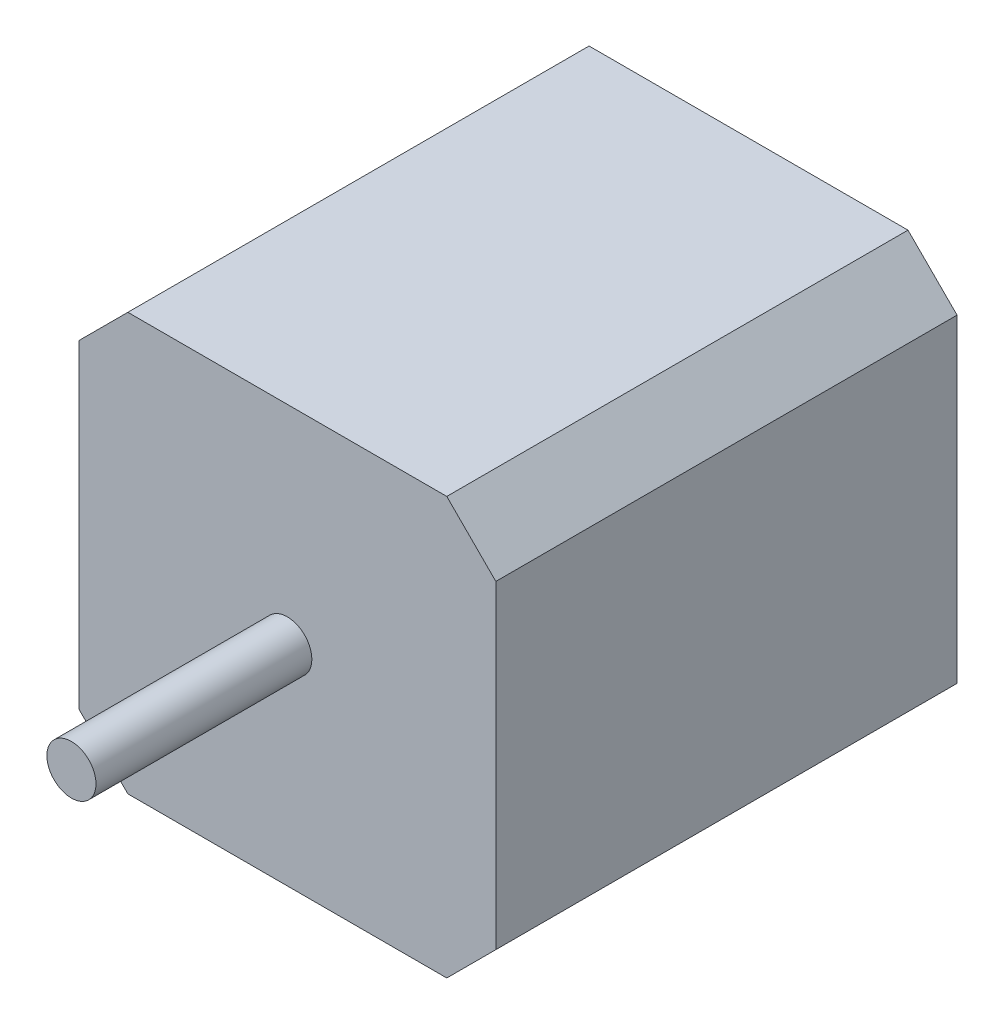
ISO-10303-21;
HEADER;
FILE_DESCRIPTION(('STEP AP214'),'2;1');
FILE_NAME('part.step','',(''),(''),'','','');
FILE_SCHEMA(('AUTOMOTIVE_DESIGN { 1 0 10303 214 1 1 1 1 }'));
ENDSEC;
DATA;
#1=APPLICATION_CONTEXT('core data for automotive mechanical design processes');
#2=APPLICATION_PROTOCOL_DEFINITION('international standard','automotive_design',2000,#1);
#3=PRODUCT_CONTEXT('',#1,'mechanical');
#4=PRODUCT('Part','Part','',(#3));
#5=PRODUCT_RELATED_PRODUCT_CATEGORY('part','',(#4));
#6=PRODUCT_DEFINITION_FORMATION('','',#4);
#7=PRODUCT_DEFINITION_CONTEXT('part definition',#1,'design');
#8=PRODUCT_DEFINITION('design','',#6,#7);
#9=PRODUCT_DEFINITION_SHAPE('','',#8);
#10=(LENGTH_UNIT() NAMED_UNIT(*) SI_UNIT(.MILLI.,.METRE.));
#11=(NAMED_UNIT(*) PLANE_ANGLE_UNIT() SI_UNIT($,.RADIAN.));
#12=(NAMED_UNIT(*) SI_UNIT($,.STERADIAN.) SOLID_ANGLE_UNIT());
#13=UNCERTAINTY_MEASURE_WITH_UNIT(LENGTH_MEASURE(1.E-05),#10,'distance_accuracy_value','');
#14=(GEOMETRIC_REPRESENTATION_CONTEXT(3) GLOBAL_UNCERTAINTY_ASSIGNED_CONTEXT((#13)) GLOBAL_UNIT_ASSIGNED_CONTEXT((#10,
#11,#12)) REPRESENTATION_CONTEXT('',''));
#15=CARTESIAN_POINT('',(0.,0.,0.));
#16=DIRECTION('',(0.,0.,1.));
#17=DIRECTION('',(1.,0.,0.));
#18=AXIS2_PLACEMENT_3D('',#15,#16,#17);
#19=CARTESIAN_POINT('',(0.,0.,47.));
#20=DIRECTION('',(0.,0.,1.));
#21=DIRECTION('',(1.,0.,0.));
#22=AXIS2_PLACEMENT_3D('',#19,#20,#21);
#23=PLANE('',#22);
#24=DIRECTION('',(1.,0.,0.));
#25=VECTOR('',#24,1.);
#26=CARTESIAN_POINT('',(-41.6448477794809,-14.902025479471,47.));
#27=LINE('',#26,#25);
#28=CARTESIAN_POINT('',(-36.6448477794809,-14.902025479471,47.));
#29=VERTEX_POINT('',#28);
#30=CARTESIAN_POINT('',(-4.14484777948092,-14.902025479471,47.));
#31=VERTEX_POINT('',#30);
#32=EDGE_CURVE('E169',#29,#31,#27,.T.);
#33=ORIENTED_EDGE('',*,*,#32,.T.);
#34=DIRECTION('',(-0.707106781186548,-0.707106781186547,0.));
#35=VECTOR('',#34,1.);
#36=CARTESIAN_POINT('',(5.37858884999505,-5.37858884999506,47.));
#37=LINE('',#36,#35);
#38=CARTESIAN_POINT('',(0.855152220519106,-9.90202547947099,47.));
#39=VERTEX_POINT('',#38);
#40=EDGE_CURVE('E147',#31,#39,#37,.F.);
#41=ORIENTED_EDGE('',*,*,#40,.T.);
#42=DIRECTION('',(0.,1.,0.));
#43=VECTOR('',#42,1.);
#44=CARTESIAN_POINT('',(0.855152220519101,27.597974520529,47.));
#45=LINE('',#44,#43);
#46=CARTESIAN_POINT('',(0.855152220519099,22.597974520529,47.));
#47=VERTEX_POINT('',#46);
#48=EDGE_CURVE('E118',#39,#47,#45,.T.);
#49=ORIENTED_EDGE('',*,*,#48,.T.);
#50=DIRECTION('',(0.707106781186547,-0.707106781186548,0.));
#51=VECTOR('',#50,1.);
#52=CARTESIAN_POINT('',(11.7265633705241,11.726563370524,47.));
#53=LINE('',#52,#51);
#54=CARTESIAN_POINT('',(-4.14484777948089,27.597974520529,47.));
#55=VERTEX_POINT('',#54);
#56=EDGE_CURVE('E54',#47,#55,#53,.F.);
#57=ORIENTED_EDGE('',*,*,#56,.T.);
#58=DIRECTION('',(-1.,0.,0.));
#59=VECTOR('',#58,1.);
#60=CARTESIAN_POINT('',(-41.6448477794809,27.597974520529,47.));
#61=LINE('',#60,#59);
#62=CARTESIAN_POINT('',(-36.6448477794809,27.597974520529,47.));
#63=VERTEX_POINT('',#62);
#64=EDGE_CURVE('E133',#55,#63,#61,.T.);
#65=ORIENTED_EDGE('',*,*,#64,.T.);
#66=DIRECTION('',(0.707106781186549,0.707106781186547,0.));
#67=VECTOR('',#66,1.);
#68=CARTESIAN_POINT('',(-32.1214111500049,32.121411150005,47.));
#69=LINE('',#68,#67);
#70=CARTESIAN_POINT('',(-41.6448477794809,22.597974520529,47.));
#71=VERTEX_POINT('',#70);
#72=EDGE_CURVE('E143',#63,#71,#69,.F.);
#73=ORIENTED_EDGE('',*,*,#72,.T.);
#74=DIRECTION('',(0.,-1.,0.));
#75=VECTOR('',#74,1.);
#76=CARTESIAN_POINT('',(-41.6448477794809,27.597974520529,47.));
#77=LINE('',#76,#75);
#78=CARTESIAN_POINT('',(-41.6448477794809,-9.90202547947095,47.));
#79=VERTEX_POINT('',#78);
#80=EDGE_CURVE('E127',#71,#79,#77,.T.);
#81=ORIENTED_EDGE('',*,*,#80,.T.);
#82=DIRECTION('',(-0.707106781186546,0.70710678118655,0.));
#83=VECTOR('',#82,1.);
#84=CARTESIAN_POINT('',(-25.773436629476,-25.7734366294759,47.));
#85=LINE('',#84,#83);
#86=EDGE_CURVE('E145',#79,#29,#85,.F.);
#87=ORIENTED_EDGE('',*,*,#86,.T.);
#88=EDGE_LOOP('',(#33,#41,#49,#57,#65,#73,#81,#87));
#89=FACE_BOUND('',#88,.T.);
#90=CARTESIAN_POINT('',(-20.3948477794809,6.347974520529,47.));
#91=DIRECTION('',(0.,0.,1.));
#92=DIRECTION('',(1.,0.,0.));
#93=AXIS2_PLACEMENT_3D('',#90,#91,#92);
#94=CIRCLE('',#93,2.5);
#95=CARTESIAN_POINT('',(-17.8948477794809,6.347974520529,47.));
#96=VERTEX_POINT('',#95);
#97=EDGE_CURVE('E174',#96,#96,#94,.T.);
#98=ORIENTED_EDGE('',*,*,#97,.F.);
#99=EDGE_LOOP('',(#98));
#100=FACE_BOUND('',#99,.T.);
#101=ADVANCED_FACE('F34',(#89,#100),#23,.T.);
#102=CARTESIAN_POINT('',(-41.6448477794809,27.597974520529,47.));
#103=DIRECTION('',(1.,0.,0.));
#104=DIRECTION('',(0.,0.,-1.));
#105=AXIS2_PLACEMENT_3D('',#102,#103,#104);
#106=PLANE('',#105);
#107=DIRECTION('',(0.,-1.,0.));
#108=VECTOR('',#107,1.);
#109=CARTESIAN_POINT('',(-41.6448477794809,27.597974520529,0.));
#110=LINE('',#109,#108);
#111=CARTESIAN_POINT('',(-41.6448477794809,22.597974520529,0.));
#112=VERTEX_POINT('',#111);
#113=CARTESIAN_POINT('',(-41.6448477794809,-9.90202547947096,0.));
#114=VERTEX_POINT('',#113);
#115=EDGE_CURVE('E129',#112,#114,#110,.T.);
#116=ORIENTED_EDGE('',*,*,#115,.T.);
#117=DIRECTION('',(0.,0.,1.));
#118=VECTOR('',#117,1.);
#119=CARTESIAN_POINT('',(-41.6448477794809,-9.90202547947096,47.));
#120=LINE('',#119,#118);
#121=EDGE_CURVE('E152',#114,#79,#120,.T.);
#122=ORIENTED_EDGE('',*,*,#121,.T.);
#123=ORIENTED_EDGE('',*,*,#80,.F.);
#124=DIRECTION('',(0.,0.,-1.));
#125=VECTOR('',#124,1.);
#126=CARTESIAN_POINT('',(-41.6448477794809,22.597974520529,47.));
#127=LINE('',#126,#125);
#128=EDGE_CURVE('E149',#71,#112,#127,.T.);
#129=ORIENTED_EDGE('',*,*,#128,.T.);
#130=EDGE_LOOP('',(#116,#122,#123,#129));
#131=FACE_BOUND('',#130,.T.);
#132=ADVANCED_FACE('F165',(#131),#106,.F.);
#133=CARTESIAN_POINT('',(-41.6448477794809,-14.902025479471,47.));
#134=DIRECTION('',(0.,1.,0.));
#135=DIRECTION('',(0.,0.,1.));
#136=AXIS2_PLACEMENT_3D('',#133,#134,#135);
#137=PLANE('',#136);
#138=DIRECTION('',(1.,0.,0.));
#139=VECTOR('',#138,1.);
#140=CARTESIAN_POINT('',(-41.6448477794809,-14.902025479471,0.));
#141=LINE('',#140,#139);
#142=CARTESIAN_POINT('',(-36.6448477794809,-14.902025479471,0.));
#143=VERTEX_POINT('',#142);
#144=CARTESIAN_POINT('',(-4.14484777948091,-14.902025479471,0.));
#145=VERTEX_POINT('',#144);
#146=EDGE_CURVE('E125',#143,#145,#141,.T.);
#147=ORIENTED_EDGE('',*,*,#146,.T.);
#148=DIRECTION('',(0.,0.,1.));
#149=VECTOR('',#148,1.);
#150=CARTESIAN_POINT('',(-4.14484777948091,-14.902025479471,47.));
#151=LINE('',#150,#149);
#152=EDGE_CURVE('E104',#145,#31,#151,.T.);
#153=ORIENTED_EDGE('',*,*,#152,.T.);
#154=ORIENTED_EDGE('',*,*,#32,.F.);
#155=DIRECTION('',(0.,0.,-1.));
#156=VECTOR('',#155,1.);
#157=CARTESIAN_POINT('',(-36.6448477794809,-14.902025479471,47.));
#158=LINE('',#157,#156);
#159=EDGE_CURVE('E109',#29,#143,#158,.T.);
#160=ORIENTED_EDGE('',*,*,#159,.T.);
#161=EDGE_LOOP('',(#147,#153,#154,#160));
#162=FACE_BOUND('',#161,.T.);
#163=ADVANCED_FACE('F192',(#162),#137,.F.);
#164=CARTESIAN_POINT('',(0.855152220519101,27.597974520529,47.));
#165=DIRECTION('',(-1.,0.,0.));
#166=DIRECTION('',(0.,-1.,0.));
#167=AXIS2_PLACEMENT_3D('',#164,#165,#166);
#168=PLANE('',#167);
#169=ORIENTED_EDGE('',*,*,#48,.F.);
#170=DIRECTION('',(0.,0.,-1.));
#171=VECTOR('',#170,1.);
#172=CARTESIAN_POINT('',(0.855152220519105,-9.90202547947099,47.));
#173=LINE('',#172,#171);
#174=CARTESIAN_POINT('',(0.855152220519107,-9.90202547947099,0.));
#175=VERTEX_POINT('',#174);
#176=EDGE_CURVE('E103',#39,#175,#173,.T.);
#177=ORIENTED_EDGE('',*,*,#176,.T.);
#178=DIRECTION('',(0.,1.,0.));
#179=VECTOR('',#178,1.);
#180=CARTESIAN_POINT('',(0.855152220519101,27.597974520529,0.));
#181=LINE('',#180,#179);
#182=CARTESIAN_POINT('',(0.855152220519102,22.597974520529,0.));
#183=VERTEX_POINT('',#182);
#184=EDGE_CURVE('E116',#175,#183,#181,.T.);
#185=ORIENTED_EDGE('',*,*,#184,.T.);
#186=DIRECTION('',(0.,0.,1.));
#187=VECTOR('',#186,1.);
#188=CARTESIAN_POINT('',(0.855152220519102,22.597974520529,47.));
#189=LINE('',#188,#187);
#190=EDGE_CURVE('E120',#183,#47,#189,.T.);
#191=ORIENTED_EDGE('',*,*,#190,.T.);
#192=EDGE_LOOP('',(#169,#177,#185,#191));
#193=FACE_BOUND('',#192,.T.);
#194=ADVANCED_FACE('F115',(#193),#168,.F.);
#195=CARTESIAN_POINT('',(-41.6448477794809,27.597974520529,47.));
#196=DIRECTION('',(0.,-1.,0.));
#197=DIRECTION('',(0.,0.,-1.));
#198=AXIS2_PLACEMENT_3D('',#195,#196,#197);
#199=PLANE('',#198);
#200=DIRECTION('',(-1.,0.,0.));
#201=VECTOR('',#200,1.);
#202=CARTESIAN_POINT('',(-41.6448477794809,27.597974520529,0.));
#203=LINE('',#202,#201);
#204=CARTESIAN_POINT('',(-4.14484777948089,27.597974520529,0.));
#205=VERTEX_POINT('',#204);
#206=CARTESIAN_POINT('',(-36.6448477794809,27.597974520529,0.));
#207=VERTEX_POINT('',#206);
#208=EDGE_CURVE('E124',#205,#207,#203,.T.);
#209=ORIENTED_EDGE('',*,*,#208,.T.);
#210=DIRECTION('',(0.,0.,1.));
#211=VECTOR('',#210,1.);
#212=CARTESIAN_POINT('',(-36.6448477794809,27.597974520529,47.));
#213=LINE('',#212,#211);
#214=EDGE_CURVE('E11',#207,#63,#213,.T.);
#215=ORIENTED_EDGE('',*,*,#214,.T.);
#216=ORIENTED_EDGE('',*,*,#64,.F.);
#217=DIRECTION('',(0.,0.,-1.));
#218=VECTOR('',#217,1.);
#219=CARTESIAN_POINT('',(-4.14484777948088,27.597974520529,47.));
#220=LINE('',#219,#218);
#221=EDGE_CURVE('E42',#55,#205,#220,.T.);
#222=ORIENTED_EDGE('',*,*,#221,.T.);
#223=EDGE_LOOP('',(#209,#215,#216,#222));
#224=FACE_BOUND('',#223,.T.);
#225=ADVANCED_FACE('F155',(#224),#199,.F.);
#226=CARTESIAN_POINT('',(0.,0.,0.));
#227=DIRECTION('',(0.,0.,1.));
#228=DIRECTION('',(1.,0.,0.));
#229=AXIS2_PLACEMENT_3D('',#226,#227,#228);
#230=PLANE('',#229);
#231=ORIENTED_EDGE('',*,*,#184,.F.);
#232=DIRECTION('',(0.707106781186548,0.707106781186547,0.));
#233=VECTOR('',#232,1.);
#234=CARTESIAN_POINT('',(0.855152220519105,-9.90202547947099,0.));
#235=LINE('',#234,#233);
#236=EDGE_CURVE('E99',#175,#145,#235,.F.);
#237=ORIENTED_EDGE('',*,*,#236,.T.);
#238=ORIENTED_EDGE('',*,*,#146,.F.);
#239=DIRECTION('',(0.707106781186546,-0.70710678118655,0.));
#240=VECTOR('',#239,1.);
#241=CARTESIAN_POINT('',(-36.6448477794809,-14.902025479471,0.));
#242=LINE('',#241,#240);
#243=EDGE_CURVE('E110',#143,#114,#242,.F.);
#244=ORIENTED_EDGE('',*,*,#243,.T.);
#245=ORIENTED_EDGE('',*,*,#115,.F.);
#246=DIRECTION('',(-0.707106781186549,-0.707106781186547,0.));
#247=VECTOR('',#246,1.);
#248=CARTESIAN_POINT('',(-41.6448477794809,22.597974520529,0.));
#249=LINE('',#248,#247);
#250=EDGE_CURVE('E136',#112,#207,#249,.F.);
#251=ORIENTED_EDGE('',*,*,#250,.T.);
#252=ORIENTED_EDGE('',*,*,#208,.F.);
#253=DIRECTION('',(-0.707106781186547,0.707106781186548,0.));
#254=VECTOR('',#253,1.);
#255=CARTESIAN_POINT('',(-4.14484777948088,27.597974520529,0.));
#256=LINE('',#255,#254);
#257=EDGE_CURVE('E119',#205,#183,#256,.F.);
#258=ORIENTED_EDGE('',*,*,#257,.T.);
#259=EDGE_LOOP('',(#231,#237,#238,#244,#245,#251,#252,#258));
#260=FACE_BOUND('',#259,.T.);
#261=ADVANCED_FACE('F122',(#260),#230,.F.);
#262=CARTESIAN_POINT('',(0.855152220519105,-9.90202547947099,47.));
#263=DIRECTION('',(-0.707106781186547,0.707106781186548,0.));
#264=DIRECTION('',(0.,0.,-1.));
#265=AXIS2_PLACEMENT_3D('',#262,#263,#264);
#266=PLANE('',#265);
#267=ORIENTED_EDGE('',*,*,#40,.F.);
#268=ORIENTED_EDGE('',*,*,#152,.F.);
#269=ORIENTED_EDGE('',*,*,#236,.F.);
#270=ORIENTED_EDGE('',*,*,#176,.F.);
#271=EDGE_LOOP('',(#267,#268,#269,#270));
#272=FACE_BOUND('',#271,.T.);
#273=ADVANCED_FACE('F102',(#272),#266,.F.);
#274=CARTESIAN_POINT('',(-36.6448477794809,-14.902025479471,47.));
#275=DIRECTION('',(0.70710678118655,0.707106781186546,0.));
#276=DIRECTION('',(0.,0.,-1.));
#277=AXIS2_PLACEMENT_3D('',#274,#275,#276);
#278=PLANE('',#277);
#279=ORIENTED_EDGE('',*,*,#86,.F.);
#280=ORIENTED_EDGE('',*,*,#121,.F.);
#281=ORIENTED_EDGE('',*,*,#243,.F.);
#282=ORIENTED_EDGE('',*,*,#159,.F.);
#283=EDGE_LOOP('',(#279,#280,#281,#282));
#284=FACE_BOUND('',#283,.T.);
#285=ADVANCED_FACE('F208',(#284),#278,.F.);
#286=CARTESIAN_POINT('',(-41.6448477794809,22.597974520529,47.));
#287=DIRECTION('',(0.707106781186546,-0.707106781186548,0.));
#288=DIRECTION('',(0.,0.,-1.));
#289=AXIS2_PLACEMENT_3D('',#286,#287,#288);
#290=PLANE('',#289);
#291=ORIENTED_EDGE('',*,*,#72,.F.);
#292=ORIENTED_EDGE('',*,*,#214,.F.);
#293=ORIENTED_EDGE('',*,*,#250,.F.);
#294=ORIENTED_EDGE('',*,*,#128,.F.);
#295=EDGE_LOOP('',(#291,#292,#293,#294));
#296=FACE_BOUND('',#295,.T.);
#297=ADVANCED_FACE('F162',(#296),#290,.F.);
#298=CARTESIAN_POINT('',(-4.14484777948088,27.597974520529,47.));
#299=DIRECTION('',(-0.707106781186548,-0.707106781186547,0.));
#300=DIRECTION('',(0.,0.,-1.));
#301=AXIS2_PLACEMENT_3D('',#298,#299,#300);
#302=PLANE('',#301);
#303=ORIENTED_EDGE('',*,*,#56,.F.);
#304=ORIENTED_EDGE('',*,*,#190,.F.);
#305=ORIENTED_EDGE('',*,*,#257,.F.);
#306=ORIENTED_EDGE('',*,*,#221,.F.);
#307=EDGE_LOOP('',(#303,#304,#305,#306));
#308=FACE_BOUND('',#307,.T.);
#309=ADVANCED_FACE('F36',(#308),#302,.F.);
#310=CARTESIAN_POINT('',(-20.3948477794809,6.347974520529,69.));
#311=DIRECTION('',(0.,0.,-1.));
#312=DIRECTION('',(-1.,0.,0.));
#313=AXIS2_PLACEMENT_3D('',#310,#311,#312);
#314=CYLINDRICAL_SURFACE('',#313,2.5);
#315=CARTESIAN_POINT('',(-20.3948477794809,6.347974520529,69.));
#316=DIRECTION('',(0.,0.,1.));
#317=DIRECTION('',(1.,0.,0.));
#318=AXIS2_PLACEMENT_3D('',#315,#316,#317);
#319=CIRCLE('',#318,2.5);
#320=CARTESIAN_POINT('',(-17.8948477794809,6.347974520529,69.));
#321=VERTEX_POINT('',#320);
#322=EDGE_CURVE('E178',#321,#321,#319,.T.);
#323=ORIENTED_EDGE('',*,*,#322,.F.);
#324=EDGE_LOOP('',(#323));
#325=FACE_BOUND('',#324,.T.);
#326=ORIENTED_EDGE('',*,*,#97,.T.);
#327=EDGE_LOOP('',(#326));
#328=FACE_BOUND('',#327,.T.);
#329=ADVANCED_FACE('F185',(#325,#328),#314,.T.);
#330=CARTESIAN_POINT('',(-20.3948477794809,6.347974520529,69.));
#331=DIRECTION('',(0.,0.,1.));
#332=DIRECTION('',(1.,0.,0.));
#333=AXIS2_PLACEMENT_3D('',#330,#331,#332);
#334=PLANE('',#333);
#335=ORIENTED_EDGE('',*,*,#322,.T.);
#336=EDGE_LOOP('',(#335));
#337=FACE_BOUND('',#336,.T.);
#338=ADVANCED_FACE('F218',(#337),#334,.T.);
#339=CLOSED_SHELL('',(#101,#132,#163,#194,#225,#261,#273,#285,#297,#309,#329,#338));
#340=MANIFOLD_SOLID_BREP('B2',#339);
#341=ADVANCED_BREP_SHAPE_REPRESENTATION('',(#18,#340),#14);
#342=SHAPE_DEFINITION_REPRESENTATION(#9,#341);
ENDSEC;
END-ISO-10303-21;
